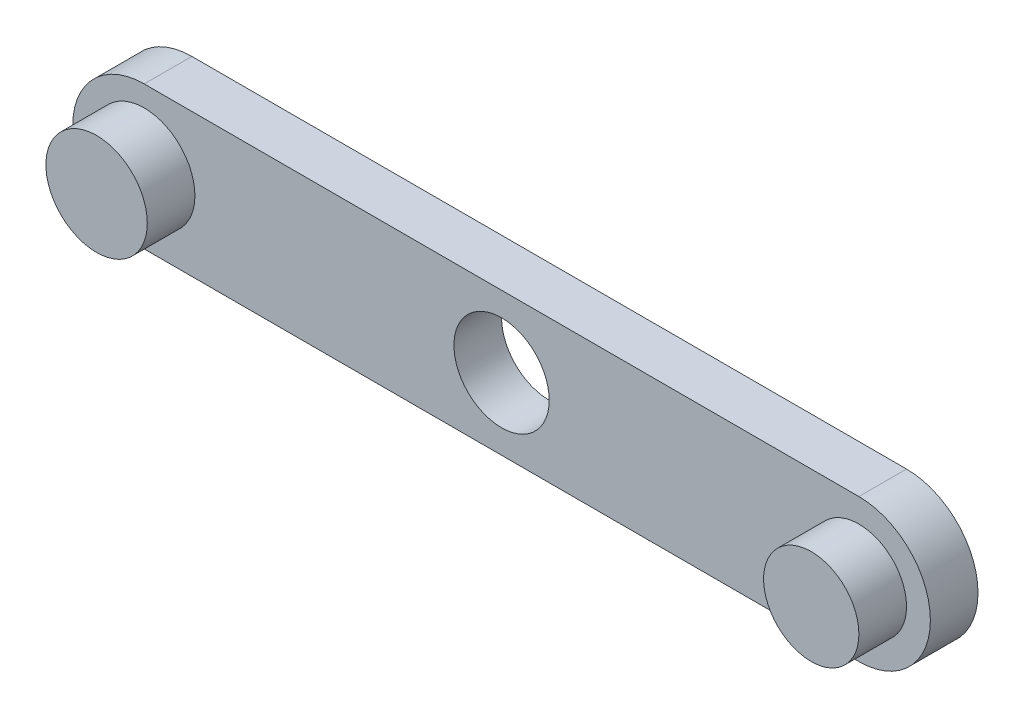
ISO-10303-21;
HEADER;
FILE_DESCRIPTION(('STEP AP214'),'2;1');
FILE_NAME('part.step','',(''),(''),'','','');
FILE_SCHEMA(('AUTOMOTIVE_DESIGN { 1 0 10303 214 1 1 1 1 }'));
ENDSEC;
DATA;
#1=APPLICATION_CONTEXT('core data for automotive mechanical design processes');
#2=APPLICATION_PROTOCOL_DEFINITION('international standard','automotive_design',2000,#1);
#3=PRODUCT_CONTEXT('',#1,'mechanical');
#4=PRODUCT('Part','Part','',(#3));
#5=PRODUCT_RELATED_PRODUCT_CATEGORY('part','',(#4));
#6=PRODUCT_DEFINITION_FORMATION('','',#4);
#7=PRODUCT_DEFINITION_CONTEXT('part definition',#1,'design');
#8=PRODUCT_DEFINITION('design','',#6,#7);
#9=PRODUCT_DEFINITION_SHAPE('','',#8);
#10=(LENGTH_UNIT() NAMED_UNIT(*) SI_UNIT(.MILLI.,.METRE.));
#11=(NAMED_UNIT(*) PLANE_ANGLE_UNIT() SI_UNIT($,.RADIAN.));
#12=(NAMED_UNIT(*) SI_UNIT($,.STERADIAN.) SOLID_ANGLE_UNIT());
#13=UNCERTAINTY_MEASURE_WITH_UNIT(LENGTH_MEASURE(1.E-05),#10,'distance_accuracy_value','');
#14=(GEOMETRIC_REPRESENTATION_CONTEXT(3) GLOBAL_UNCERTAINTY_ASSIGNED_CONTEXT((#13)) GLOBAL_UNIT_ASSIGNED_CONTEXT((#10,
#11,#12)) REPRESENTATION_CONTEXT('',''));
#15=CARTESIAN_POINT('',(0.,0.,0.));
#16=DIRECTION('',(0.,0.,1.));
#17=DIRECTION('',(1.,0.,0.));
#18=AXIS2_PLACEMENT_3D('',#15,#16,#17);
#19=CARTESIAN_POINT('',(0.,0.,10.));
#20=DIRECTION('',(0.,0.,1.));
#21=DIRECTION('',(1.,0.,0.));
#22=AXIS2_PLACEMENT_3D('',#19,#20,#21);
#23=PLANE('',#22);
#24=CARTESIAN_POINT('',(150.,0.,10.));
#25=DIRECTION('',(0.,0.,1.));
#26=DIRECTION('',(1.,0.,0.));
#27=AXIS2_PLACEMENT_3D('',#24,#25,#26);
#28=CIRCLE('',#27,10.);
#29=CARTESIAN_POINT('',(160.,0.,10.));
#30=VERTEX_POINT('',#29);
#31=EDGE_CURVE('E146',#30,#30,#28,.T.);
#32=ORIENTED_EDGE('',*,*,#31,.F.);
#33=EDGE_LOOP('',(#32));
#34=FACE_BOUND('',#33,.T.);
#35=CARTESIAN_POINT('',(0.,0.,10.));
#36=DIRECTION('',(0.,0.,1.));
#37=DIRECTION('',(1.,0.,0.));
#38=AXIS2_PLACEMENT_3D('',#35,#36,#37);
#39=CIRCLE('',#38,10.6386323558247);
#40=CARTESIAN_POINT('',(10.6386323558247,0.,10.));
#41=VERTEX_POINT('',#40);
#42=EDGE_CURVE('E138',#41,#41,#39,.T.);
#43=ORIENTED_EDGE('',*,*,#42,.F.);
#44=EDGE_LOOP('',(#43));
#45=FACE_BOUND('',#44,.T.);
#46=CARTESIAN_POINT('',(0.,0.,10.));
#47=DIRECTION('',(0.,0.,1.));
#48=DIRECTION('',(1.,0.,0.));
#49=AXIS2_PLACEMENT_3D('',#46,#47,#48);
#50=CIRCLE('',#49,15.);
#51=CARTESIAN_POINT('',(0.,15.,10.));
#52=VERTEX_POINT('',#51);
#53=CARTESIAN_POINT('',(0.,-15.,10.));
#54=VERTEX_POINT('',#53);
#55=EDGE_CURVE('E92',#52,#54,#50,.T.);
#56=ORIENTED_EDGE('',*,*,#55,.T.);
#57=DIRECTION('',(1.,0.,0.));
#58=VECTOR('',#57,1.);
#59=CARTESIAN_POINT('',(0.,-15.,10.));
#60=LINE('',#59,#58);
#61=CARTESIAN_POINT('',(150.,-15.,10.));
#62=VERTEX_POINT('',#61);
#63=EDGE_CURVE('E87',#54,#62,#60,.T.);
#64=ORIENTED_EDGE('',*,*,#63,.T.);
#65=CARTESIAN_POINT('',(150.,0.,10.));
#66=DIRECTION('',(0.,0.,1.));
#67=DIRECTION('',(1.,0.,0.));
#68=AXIS2_PLACEMENT_3D('',#65,#66,#67);
#69=CIRCLE('',#68,15.);
#70=CARTESIAN_POINT('',(150.,15.,10.));
#71=VERTEX_POINT('',#70);
#72=EDGE_CURVE('E90',#62,#71,#69,.T.);
#73=ORIENTED_EDGE('',*,*,#72,.T.);
#74=DIRECTION('',(-1.,0.,0.));
#75=VECTOR('',#74,1.);
#76=CARTESIAN_POINT('',(0.,15.,10.));
#77=LINE('',#76,#75);
#78=EDGE_CURVE('E57',#71,#52,#77,.T.);
#79=ORIENTED_EDGE('',*,*,#78,.T.);
#80=EDGE_LOOP('',(#56,#64,#73,#79));
#81=FACE_BOUND('',#80,.T.);
#82=CARTESIAN_POINT('',(75.,0.,10.));
#83=DIRECTION('',(0.,0.,1.));
#84=DIRECTION('',(1.,0.,0.));
#85=AXIS2_PLACEMENT_3D('',#82,#83,#84);
#86=CIRCLE('',#85,9.99999999999999);
#87=CARTESIAN_POINT('',(85.,0.,10.));
#88=VERTEX_POINT('',#87);
#89=EDGE_CURVE('E112',#88,#88,#86,.T.);
#90=ORIENTED_EDGE('',*,*,#89,.F.);
#91=EDGE_LOOP('',(#90));
#92=FACE_BOUND('',#91,.T.);
#93=ADVANCED_FACE('F39',(#34,#45,#81,#92),#23,.T.);
#94=CARTESIAN_POINT('',(0.,0.,0.));
#95=DIRECTION('',(0.,0.,1.));
#96=DIRECTION('',(1.,0.,0.));
#97=AXIS2_PLACEMENT_3D('',#94,#95,#96);
#98=PLANE('',#97);
#99=CARTESIAN_POINT('',(0.,0.,0.));
#100=DIRECTION('',(0.,0.,1.));
#101=DIRECTION('',(1.,0.,0.));
#102=AXIS2_PLACEMENT_3D('',#99,#100,#101);
#103=CIRCLE('',#102,15.);
#104=CARTESIAN_POINT('',(0.,15.,0.));
#105=VERTEX_POINT('',#104);
#106=CARTESIAN_POINT('',(0.,-15.,0.));
#107=VERTEX_POINT('',#106);
#108=EDGE_CURVE('E108',#105,#107,#103,.T.);
#109=ORIENTED_EDGE('',*,*,#108,.F.);
#110=DIRECTION('',(-1.,0.,0.));
#111=VECTOR('',#110,1.);
#112=CARTESIAN_POINT('',(0.,15.,0.));
#113=LINE('',#112,#111);
#114=CARTESIAN_POINT('',(150.,15.,0.));
#115=VERTEX_POINT('',#114);
#116=EDGE_CURVE('E80',#115,#105,#113,.T.);
#117=ORIENTED_EDGE('',*,*,#116,.F.);
#118=CARTESIAN_POINT('',(150.,0.,0.));
#119=DIRECTION('',(0.,0.,1.));
#120=DIRECTION('',(1.,0.,0.));
#121=AXIS2_PLACEMENT_3D('',#118,#119,#120);
#122=CIRCLE('',#121,15.);
#123=CARTESIAN_POINT('',(150.,-15.,0.));
#124=VERTEX_POINT('',#123);
#125=EDGE_CURVE('E74',#124,#115,#122,.T.);
#126=ORIENTED_EDGE('',*,*,#125,.F.);
#127=DIRECTION('',(1.,0.,0.));
#128=VECTOR('',#127,1.);
#129=CARTESIAN_POINT('',(0.,-15.,0.));
#130=LINE('',#129,#128);
#131=EDGE_CURVE('E97',#107,#124,#130,.T.);
#132=ORIENTED_EDGE('',*,*,#131,.F.);
#133=EDGE_LOOP('',(#109,#117,#126,#132));
#134=FACE_BOUND('',#133,.T.);
#135=CARTESIAN_POINT('',(75.,0.,0.));
#136=DIRECTION('',(0.,0.,1.));
#137=DIRECTION('',(1.,0.,0.));
#138=AXIS2_PLACEMENT_3D('',#135,#136,#137);
#139=CIRCLE('',#138,9.99999999999999);
#140=CARTESIAN_POINT('',(85.,0.,0.));
#141=VERTEX_POINT('',#140);
#142=EDGE_CURVE('E130',#141,#141,#139,.T.);
#143=ORIENTED_EDGE('',*,*,#142,.T.);
#144=EDGE_LOOP('',(#143));
#145=FACE_BOUND('',#144,.T.);
#146=ADVANCED_FACE('F125',(#134,#145),#98,.F.);
#147=CARTESIAN_POINT('',(0.,0.,10.));
#148=DIRECTION('',(0.,0.,-1.));
#149=DIRECTION('',(-1.,0.,0.));
#150=AXIS2_PLACEMENT_3D('',#147,#148,#149);
#151=CYLINDRICAL_SURFACE('',#150,15.);
#152=ORIENTED_EDGE('',*,*,#108,.T.);
#153=DIRECTION('',(0.,0.,-1.));
#154=VECTOR('',#153,1.);
#155=CARTESIAN_POINT('',(0.,-15.,10.));
#156=LINE('',#155,#154);
#157=EDGE_CURVE('E11',#54,#107,#156,.T.);
#158=ORIENTED_EDGE('',*,*,#157,.F.);
#159=ORIENTED_EDGE('',*,*,#55,.F.);
#160=DIRECTION('',(0.,0.,-1.));
#161=VECTOR('',#160,1.);
#162=CARTESIAN_POINT('',(0.,15.,10.));
#163=LINE('',#162,#161);
#164=EDGE_CURVE('E104',#52,#105,#163,.T.);
#165=ORIENTED_EDGE('',*,*,#164,.T.);
#166=EDGE_LOOP('',(#152,#158,#159,#165));
#167=FACE_BOUND('',#166,.T.);
#168=ADVANCED_FACE('F41',(#167),#151,.T.);
#169=CARTESIAN_POINT('',(0.,-15.,10.));
#170=DIRECTION('',(0.,1.,0.));
#171=DIRECTION('',(0.,0.,1.));
#172=AXIS2_PLACEMENT_3D('',#169,#170,#171);
#173=PLANE('',#172);
#174=ORIENTED_EDGE('',*,*,#131,.T.);
#175=DIRECTION('',(0.,0.,-1.));
#176=VECTOR('',#175,1.);
#177=CARTESIAN_POINT('',(150.,-15.,10.));
#178=LINE('',#177,#176);
#179=EDGE_CURVE('E49',#62,#124,#178,.T.);
#180=ORIENTED_EDGE('',*,*,#179,.F.);
#181=ORIENTED_EDGE('',*,*,#63,.F.);
#182=ORIENTED_EDGE('',*,*,#157,.T.);
#183=EDGE_LOOP('',(#174,#180,#181,#182));
#184=FACE_BOUND('',#183,.T.);
#185=ADVANCED_FACE('F96',(#184),#173,.F.);
#186=CARTESIAN_POINT('',(150.,0.,10.));
#187=DIRECTION('',(0.,0.,-1.));
#188=DIRECTION('',(-1.,0.,0.));
#189=AXIS2_PLACEMENT_3D('',#186,#187,#188);
#190=CYLINDRICAL_SURFACE('',#189,15.);
#191=ORIENTED_EDGE('',*,*,#125,.T.);
#192=DIRECTION('',(0.,0.,-1.));
#193=VECTOR('',#192,1.);
#194=CARTESIAN_POINT('',(150.,15.,10.));
#195=LINE('',#194,#193);
#196=EDGE_CURVE('E99',#71,#115,#195,.T.);
#197=ORIENTED_EDGE('',*,*,#196,.F.);
#198=ORIENTED_EDGE('',*,*,#72,.F.);
#199=ORIENTED_EDGE('',*,*,#179,.T.);
#200=EDGE_LOOP('',(#191,#197,#198,#199));
#201=FACE_BOUND('',#200,.T.);
#202=ADVANCED_FACE('F100',(#201),#190,.T.);
#203=CARTESIAN_POINT('',(0.,15.,10.));
#204=DIRECTION('',(0.,-1.,0.));
#205=DIRECTION('',(0.,0.,-1.));
#206=AXIS2_PLACEMENT_3D('',#203,#204,#205);
#207=PLANE('',#206);
#208=ORIENTED_EDGE('',*,*,#116,.T.);
#209=ORIENTED_EDGE('',*,*,#164,.F.);
#210=ORIENTED_EDGE('',*,*,#78,.F.);
#211=ORIENTED_EDGE('',*,*,#196,.T.);
#212=EDGE_LOOP('',(#208,#209,#210,#211));
#213=FACE_BOUND('',#212,.T.);
#214=ADVANCED_FACE('F122',(#213),#207,.F.);
#215=CARTESIAN_POINT('',(75.,0.,10.));
#216=DIRECTION('',(0.,0.,-1.));
#217=DIRECTION('',(-1.,0.,0.));
#218=AXIS2_PLACEMENT_3D('',#215,#216,#217);
#219=CYLINDRICAL_SURFACE('',#218,9.99999999999999);
#220=ORIENTED_EDGE('',*,*,#89,.T.);
#221=EDGE_LOOP('',(#220));
#222=FACE_BOUND('',#221,.T.);
#223=ORIENTED_EDGE('',*,*,#142,.F.);
#224=EDGE_LOOP('',(#223));
#225=FACE_BOUND('',#224,.T.);
#226=ADVANCED_FACE('F170',(#222,#225),#219,.F.);
#227=CARTESIAN_POINT('',(0.,0.,20.));
#228=DIRECTION('',(0.,0.,-1.));
#229=DIRECTION('',(-1.,0.,0.));
#230=AXIS2_PLACEMENT_3D('',#227,#228,#229);
#231=CYLINDRICAL_SURFACE('',#230,10.6386323558247);
#232=CARTESIAN_POINT('',(0.,0.,20.));
#233=DIRECTION('',(0.,0.,1.));
#234=DIRECTION('',(1.,0.,0.));
#235=AXIS2_PLACEMENT_3D('',#232,#233,#234);
#236=CIRCLE('',#235,10.6386323558247);
#237=CARTESIAN_POINT('',(10.6386323558247,0.,20.));
#238=VERTEX_POINT('',#237);
#239=EDGE_CURVE('E134',#238,#238,#236,.T.);
#240=ORIENTED_EDGE('',*,*,#239,.F.);
#241=EDGE_LOOP('',(#240));
#242=FACE_BOUND('',#241,.T.);
#243=ORIENTED_EDGE('',*,*,#42,.T.);
#244=EDGE_LOOP('',(#243));
#245=FACE_BOUND('',#244,.T.);
#246=ADVANCED_FACE('F168',(#242,#245),#231,.T.);
#247=CARTESIAN_POINT('',(0.,0.,20.));
#248=DIRECTION('',(0.,0.,1.));
#249=DIRECTION('',(1.,0.,0.));
#250=AXIS2_PLACEMENT_3D('',#247,#248,#249);
#251=PLANE('',#250);
#252=ORIENTED_EDGE('',*,*,#239,.T.);
#253=EDGE_LOOP('',(#252));
#254=FACE_BOUND('',#253,.T.);
#255=ADVANCED_FACE('F159',(#254),#251,.T.);
#256=CARTESIAN_POINT('',(150.,0.,20.));
#257=DIRECTION('',(0.,0.,-1.));
#258=DIRECTION('',(-1.,0.,0.));
#259=AXIS2_PLACEMENT_3D('',#256,#257,#258);
#260=CYLINDRICAL_SURFACE('',#259,10.);
#261=CARTESIAN_POINT('',(150.,0.,20.));
#262=DIRECTION('',(0.,0.,1.));
#263=DIRECTION('',(1.,0.,0.));
#264=AXIS2_PLACEMENT_3D('',#261,#262,#263);
#265=CIRCLE('',#264,10.);
#266=CARTESIAN_POINT('',(160.,0.,20.));
#267=VERTEX_POINT('',#266);
#268=EDGE_CURVE('E142',#267,#267,#265,.T.);
#269=ORIENTED_EDGE('',*,*,#268,.F.);
#270=EDGE_LOOP('',(#269));
#271=FACE_BOUND('',#270,.T.);
#272=ORIENTED_EDGE('',*,*,#31,.T.);
#273=EDGE_LOOP('',(#272));
#274=FACE_BOUND('',#273,.T.);
#275=ADVANCED_FACE('F156',(#271,#274),#260,.T.);
#276=CARTESIAN_POINT('',(150.,0.,20.));
#277=DIRECTION('',(0.,0.,1.));
#278=DIRECTION('',(1.,0.,0.));
#279=AXIS2_PLACEMENT_3D('',#276,#277,#278);
#280=PLANE('',#279);
#281=ORIENTED_EDGE('',*,*,#268,.T.);
#282=EDGE_LOOP('',(#281));
#283=FACE_BOUND('',#282,.T.);
#284=ADVANCED_FACE('F154',(#283),#280,.T.);
#285=CLOSED_SHELL('',(#93,#146,#168,#185,#202,#214,#226,#246,#255,#275,#284));
#286=MANIFOLD_SOLID_BREP('B2',#285);
#287=ADVANCED_BREP_SHAPE_REPRESENTATION('',(#18,#286),#14);
#288=SHAPE_DEFINITION_REPRESENTATION(#9,#287);
ENDSEC;
END-ISO-10303-21;
